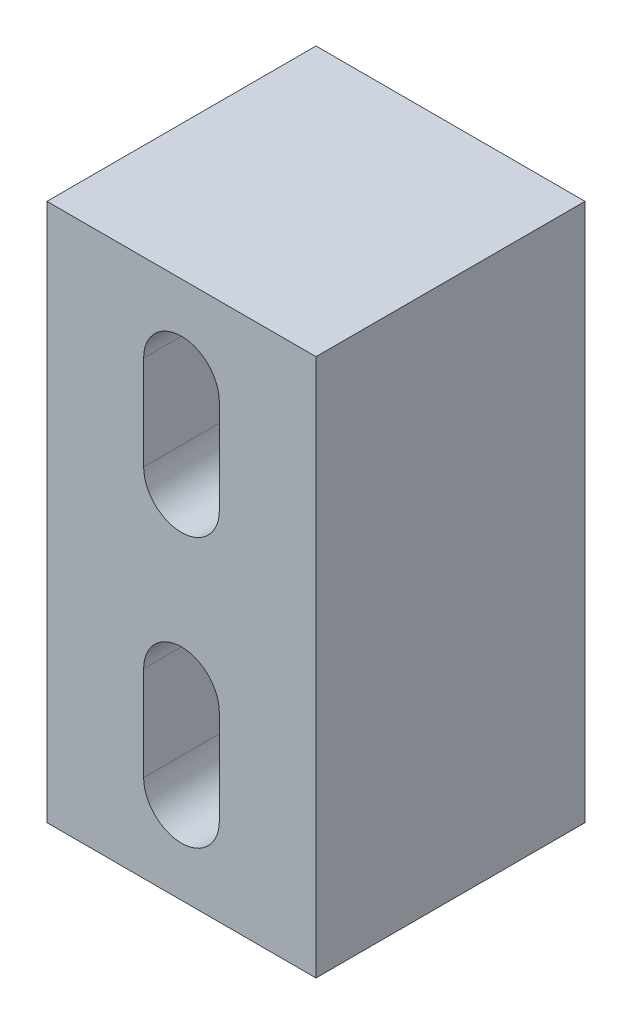
ISO-10303-21;
HEADER;
FILE_DESCRIPTION(('STEP AP214'),'2;1');
FILE_NAME('part.step','',(''),(''),'','','');
FILE_SCHEMA(('AUTOMOTIVE_DESIGN { 1 0 10303 214 1 1 1 1 }'));
ENDSEC;
DATA;
#1=APPLICATION_CONTEXT('core data for automotive mechanical design processes');
#2=APPLICATION_PROTOCOL_DEFINITION('international standard','automotive_design',2000,#1);
#3=PRODUCT_CONTEXT('',#1,'mechanical');
#4=PRODUCT('Part','Part','',(#3));
#5=PRODUCT_RELATED_PRODUCT_CATEGORY('part','',(#4));
#6=PRODUCT_DEFINITION_FORMATION('','',#4);
#7=PRODUCT_DEFINITION_CONTEXT('part definition',#1,'design');
#8=PRODUCT_DEFINITION('design','',#6,#7);
#9=PRODUCT_DEFINITION_SHAPE('','',#8);
#10=(LENGTH_UNIT() NAMED_UNIT(*) SI_UNIT(.MILLI.,.METRE.));
#11=(NAMED_UNIT(*) PLANE_ANGLE_UNIT() SI_UNIT($,.RADIAN.));
#12=(NAMED_UNIT(*) SI_UNIT($,.STERADIAN.) SOLID_ANGLE_UNIT());
#13=UNCERTAINTY_MEASURE_WITH_UNIT(LENGTH_MEASURE(1.E-05),#10,'distance_accuracy_value','');
#14=(GEOMETRIC_REPRESENTATION_CONTEXT(3) GLOBAL_UNCERTAINTY_ASSIGNED_CONTEXT((#13)) GLOBAL_UNIT_ASSIGNED_CONTEXT((#10,
#11,#12)) REPRESENTATION_CONTEXT('',''));
#15=CARTESIAN_POINT('',(0.,0.,0.));
#16=DIRECTION('',(0.,0.,1.));
#17=DIRECTION('',(1.,0.,0.));
#18=AXIS2_PLACEMENT_3D('',#15,#16,#17);
#19=CARTESIAN_POINT('',(12.7,25.4,25.4));
#20=DIRECTION('',(-1.,0.,0.));
#21=DIRECTION('',(0.,-1.,0.));
#22=AXIS2_PLACEMENT_3D('',#19,#20,#21);
#23=PLANE('',#22);
#24=DIRECTION('',(0.,1.,0.));
#25=VECTOR('',#24,1.);
#26=CARTESIAN_POINT('',(12.7,25.4,0.));
#27=LINE('',#26,#25);
#28=CARTESIAN_POINT('',(12.7,-25.4,0.));
#29=VERTEX_POINT('',#28);
#30=CARTESIAN_POINT('',(12.7,25.4,0.));
#31=VERTEX_POINT('',#30);
#32=EDGE_CURVE('E426',#29,#31,#27,.T.);
#33=ORIENTED_EDGE('',*,*,#32,.T.);
#34=DIRECTION('',(0.,0.,-1.));
#35=VECTOR('',#34,1.);
#36=CARTESIAN_POINT('',(12.7,25.4,25.4));
#37=LINE('',#36,#35);
#38=CARTESIAN_POINT('',(12.7,25.4,25.4));
#39=VERTEX_POINT('',#38);
#40=EDGE_CURVE('E453',#39,#31,#37,.T.);
#41=ORIENTED_EDGE('',*,*,#40,.F.);
#42=DIRECTION('',(0.,1.,0.));
#43=VECTOR('',#42,1.);
#44=CARTESIAN_POINT('',(12.7,25.4,25.4));
#45=LINE('',#44,#43);
#46=CARTESIAN_POINT('',(12.7,-25.4,25.4));
#47=VERTEX_POINT('',#46);
#48=EDGE_CURVE('E427',#47,#39,#45,.T.);
#49=ORIENTED_EDGE('',*,*,#48,.F.);
#50=DIRECTION('',(0.,0.,-1.));
#51=VECTOR('',#50,1.);
#52=CARTESIAN_POINT('',(12.7,-25.4,25.4));
#53=LINE('',#52,#51);
#54=EDGE_CURVE('E437',#47,#29,#53,.T.);
#55=ORIENTED_EDGE('',*,*,#54,.T.);
#56=EDGE_LOOP('',(#33,#41,#49,#55));
#57=FACE_BOUND('',#56,.T.);
#58=ADVANCED_FACE('F189',(#57),#23,.F.);
#59=CARTESIAN_POINT('',(-12.7,25.4,25.4));
#60=DIRECTION('',(0.,-1.,0.));
#61=DIRECTION('',(0.,0.,-1.));
#62=AXIS2_PLACEMENT_3D('',#59,#60,#61);
#63=PLANE('',#62);
#64=DIRECTION('',(-1.,0.,0.));
#65=VECTOR('',#64,1.);
#66=CARTESIAN_POINT('',(-12.7,25.4,0.));
#67=LINE('',#66,#65);
#68=CARTESIAN_POINT('',(-12.7,25.4,0.));
#69=VERTEX_POINT('',#68);
#70=EDGE_CURVE('E440',#31,#69,#67,.T.);
#71=ORIENTED_EDGE('',*,*,#70,.T.);
#72=DIRECTION('',(0.,0.,-1.));
#73=VECTOR('',#72,1.);
#74=CARTESIAN_POINT('',(-12.7,25.4,25.4));
#75=LINE('',#74,#73);
#76=CARTESIAN_POINT('',(-12.7,25.4,25.4));
#77=VERTEX_POINT('',#76);
#78=EDGE_CURVE('E450',#77,#69,#75,.T.);
#79=ORIENTED_EDGE('',*,*,#78,.F.);
#80=DIRECTION('',(-1.,0.,0.));
#81=VECTOR('',#80,1.);
#82=CARTESIAN_POINT('',(-12.7,25.4,25.4));
#83=LINE('',#82,#81);
#84=EDGE_CURVE('E430',#39,#77,#83,.T.);
#85=ORIENTED_EDGE('',*,*,#84,.F.);
#86=ORIENTED_EDGE('',*,*,#40,.T.);
#87=EDGE_LOOP('',(#71,#79,#85,#86));
#88=FACE_BOUND('',#87,.T.);
#89=ADVANCED_FACE('F511',(#88),#63,.F.);
#90=CARTESIAN_POINT('',(-12.7,25.4,25.4));
#91=DIRECTION('',(1.,0.,0.));
#92=DIRECTION('',(0.,1.,0.));
#93=AXIS2_PLACEMENT_3D('',#90,#91,#92);
#94=PLANE('',#93);
#95=DIRECTION('',(0.,-1.,0.));
#96=VECTOR('',#95,1.);
#97=CARTESIAN_POINT('',(-12.7,25.4,0.));
#98=LINE('',#97,#96);
#99=CARTESIAN_POINT('',(-12.7,-25.4,0.));
#100=VERTEX_POINT('',#99);
#101=EDGE_CURVE('E442',#69,#100,#98,.T.);
#102=ORIENTED_EDGE('',*,*,#101,.T.);
#103=DIRECTION('',(0.,0.,-1.));
#104=VECTOR('',#103,1.);
#105=CARTESIAN_POINT('',(-12.7,-25.4,25.4));
#106=LINE('',#105,#104);
#107=CARTESIAN_POINT('',(-12.7,-25.4,25.4));
#108=VERTEX_POINT('',#107);
#109=EDGE_CURVE('E447',#108,#100,#106,.T.);
#110=ORIENTED_EDGE('',*,*,#109,.F.);
#111=DIRECTION('',(0.,-1.,0.));
#112=VECTOR('',#111,1.);
#113=CARTESIAN_POINT('',(-12.7,25.4,25.4));
#114=LINE('',#113,#112);
#115=EDGE_CURVE('E433',#77,#108,#114,.T.);
#116=ORIENTED_EDGE('',*,*,#115,.F.);
#117=ORIENTED_EDGE('',*,*,#78,.T.);
#118=EDGE_LOOP('',(#102,#110,#116,#117));
#119=FACE_BOUND('',#118,.T.);
#120=ADVANCED_FACE('F516',(#119),#94,.F.);
#121=CARTESIAN_POINT('',(-12.7,-25.4,25.4));
#122=DIRECTION('',(0.,1.,0.));
#123=DIRECTION('',(0.,0.,1.));
#124=AXIS2_PLACEMENT_3D('',#121,#122,#123);
#125=PLANE('',#124);
#126=DIRECTION('',(1.,0.,0.));
#127=VECTOR('',#126,1.);
#128=CARTESIAN_POINT('',(-12.7,-25.4,0.));
#129=LINE('',#128,#127);
#130=EDGE_CURVE('E431',#100,#29,#129,.T.);
#131=ORIENTED_EDGE('',*,*,#130,.T.);
#132=ORIENTED_EDGE('',*,*,#54,.F.);
#133=DIRECTION('',(1.,0.,0.));
#134=VECTOR('',#133,1.);
#135=CARTESIAN_POINT('',(-12.7,-25.4,25.4));
#136=LINE('',#135,#134);
#137=EDGE_CURVE('E435',#108,#47,#136,.T.);
#138=ORIENTED_EDGE('',*,*,#137,.F.);
#139=ORIENTED_EDGE('',*,*,#109,.T.);
#140=EDGE_LOOP('',(#131,#132,#138,#139));
#141=FACE_BOUND('',#140,.T.);
#142=ADVANCED_FACE('F531',(#141),#125,.F.);
#143=CARTESIAN_POINT('',(0.,0.,25.4));
#144=DIRECTION('',(0.,0.,1.));
#145=DIRECTION('',(1.,0.,0.));
#146=AXIS2_PLACEMENT_3D('',#143,#144,#145);
#147=PLANE('',#146);
#148=DIRECTION('',(0.,1.,0.));
#149=VECTOR('',#148,1.);
#150=CARTESIAN_POINT('',(3.57251000000003,8.24865,25.4));
#151=LINE('',#150,#149);
#152=CARTESIAN_POINT('',(3.57250999999999,8.24865,25.4));
#153=VERTEX_POINT('',#152);
#154=CARTESIAN_POINT('',(3.57251000000003,17.15135,25.4));
#155=VERTEX_POINT('',#154);
#156=EDGE_CURVE('E345',#153,#155,#151,.T.);
#157=ORIENTED_EDGE('',*,*,#156,.F.);
#158=CARTESIAN_POINT('',(0.,8.24865,25.4));
#159=DIRECTION('',(0.,0.,1.));
#160=DIRECTION('',(1.,0.,0.));
#161=AXIS2_PLACEMENT_3D('',#158,#159,#160);
#162=CIRCLE('',#161,3.57250999999999);
#163=CARTESIAN_POINT('',(-3.57251000000003,8.24865,25.4));
#164=VERTEX_POINT('',#163);
#165=EDGE_CURVE('E334',#164,#153,#162,.T.);
#166=ORIENTED_EDGE('',*,*,#165,.F.);
#167=DIRECTION('',(0.,1.,0.));
#168=VECTOR('',#167,1.);
#169=CARTESIAN_POINT('',(-3.57250999999999,8.24865,25.4));
#170=LINE('',#169,#168);
#171=CARTESIAN_POINT('',(-3.57250999999999,17.15135,25.4));
#172=VERTEX_POINT('',#171);
#173=EDGE_CURVE('E355',#164,#172,#170,.T.);
#174=ORIENTED_EDGE('',*,*,#173,.T.);
#175=CARTESIAN_POINT('',(0.,17.15135,25.4));
#176=DIRECTION('',(0.,0.,1.));
#177=DIRECTION('',(1.,0.,0.));
#178=AXIS2_PLACEMENT_3D('',#175,#176,#177);
#179=CIRCLE('',#178,3.57250999999999);
#180=EDGE_CURVE('E367',#155,#172,#179,.T.);
#181=ORIENTED_EDGE('',*,*,#180,.F.);
#182=EDGE_LOOP('',(#157,#166,#174,#181));
#183=FACE_BOUND('',#182,.T.);
#184=DIRECTION('',(0.,1.,0.));
#185=VECTOR('',#184,1.);
#186=CARTESIAN_POINT('',(3.57251000000003,-17.15135,25.4));
#187=LINE('',#186,#185);
#188=CARTESIAN_POINT('',(3.57251,-17.15135,25.4));
#189=VERTEX_POINT('',#188);
#190=CARTESIAN_POINT('',(3.57251000000003,-8.24865,25.4));
#191=VERTEX_POINT('',#190);
#192=EDGE_CURVE('E376',#189,#191,#187,.T.);
#193=ORIENTED_EDGE('',*,*,#192,.F.);
#194=CARTESIAN_POINT('',(0.,-17.15135,25.4));
#195=DIRECTION('',(0.,0.,1.));
#196=DIRECTION('',(1.,0.,0.));
#197=AXIS2_PLACEMENT_3D('',#194,#195,#196);
#198=CIRCLE('',#197,3.57250999999999);
#199=CARTESIAN_POINT('',(-3.57251000000003,-17.15135,25.4));
#200=VERTEX_POINT('',#199);
#201=EDGE_CURVE('E399',#200,#189,#198,.T.);
#202=ORIENTED_EDGE('',*,*,#201,.F.);
#203=DIRECTION('',(0.,1.,0.));
#204=VECTOR('',#203,1.);
#205=CARTESIAN_POINT('',(-3.57250999999999,-17.15135,25.4));
#206=LINE('',#205,#204);
#207=CARTESIAN_POINT('',(-3.57250999999999,-8.24865,25.4));
#208=VERTEX_POINT('',#207);
#209=EDGE_CURVE('E387',#200,#208,#206,.T.);
#210=ORIENTED_EDGE('',*,*,#209,.T.);
#211=CARTESIAN_POINT('',(0.,-8.24865,25.4));
#212=DIRECTION('',(0.,0.,1.));
#213=DIRECTION('',(1.,0.,0.));
#214=AXIS2_PLACEMENT_3D('',#211,#212,#213);
#215=CIRCLE('',#214,3.57250999999999);
#216=EDGE_CURVE('E415',#191,#208,#215,.T.);
#217=ORIENTED_EDGE('',*,*,#216,.F.);
#218=EDGE_LOOP('',(#193,#202,#210,#217));
#219=FACE_BOUND('',#218,.T.);
#220=ORIENTED_EDGE('',*,*,#48,.T.);
#221=ORIENTED_EDGE('',*,*,#84,.T.);
#222=ORIENTED_EDGE('',*,*,#115,.T.);
#223=ORIENTED_EDGE('',*,*,#137,.T.);
#224=EDGE_LOOP('',(#220,#221,#222,#223));
#225=FACE_BOUND('',#224,.T.);
#226=ADVANCED_FACE('F493',(#183,#219,#225),#147,.T.);
#227=CARTESIAN_POINT('',(0.,0.,0.));
#228=DIRECTION('',(0.,0.,1.));
#229=DIRECTION('',(1.,0.,0.));
#230=AXIS2_PLACEMENT_3D('',#227,#228,#229);
#231=PLANE('',#230);
#232=CARTESIAN_POINT('',(0.,17.15135,0.));
#233=DIRECTION('',(0.,0.,1.));
#234=DIRECTION('',(1.,0.,0.));
#235=AXIS2_PLACEMENT_3D('',#232,#233,#234);
#236=CIRCLE('',#235,1.89865);
#237=CARTESIAN_POINT('',(1.89864999999999,17.15135,0.));
#238=VERTEX_POINT('',#237);
#239=CARTESIAN_POINT('',(-1.89865,17.15135,0.));
#240=VERTEX_POINT('',#239);
#241=EDGE_CURVE('E196',#238,#240,#236,.T.);
#242=ORIENTED_EDGE('',*,*,#241,.T.);
#243=DIRECTION('',(0.,-1.,0.));
#244=VECTOR('',#243,1.);
#245=CARTESIAN_POINT('',(-1.89864999999999,0.,0.));
#246=LINE('',#245,#244);
#247=CARTESIAN_POINT('',(-1.89864999999999,8.24865,0.));
#248=VERTEX_POINT('',#247);
#249=EDGE_CURVE('E13',#240,#248,#246,.T.);
#250=ORIENTED_EDGE('',*,*,#249,.T.);
#251=CARTESIAN_POINT('',(0.,8.24865,0.));
#252=DIRECTION('',(0.,0.,1.));
#253=DIRECTION('',(1.,0.,0.));
#254=AXIS2_PLACEMENT_3D('',#251,#252,#253);
#255=CIRCLE('',#254,1.89865);
#256=CARTESIAN_POINT('',(1.89864999999999,8.24865,0.));
#257=VERTEX_POINT('',#256);
#258=EDGE_CURVE('E471',#248,#257,#255,.T.);
#259=ORIENTED_EDGE('',*,*,#258,.T.);
#260=DIRECTION('',(0.,1.,0.));
#261=VECTOR('',#260,1.);
#262=CARTESIAN_POINT('',(1.89865,0.,0.));
#263=LINE('',#262,#261);
#264=EDGE_CURVE('E468',#257,#238,#263,.T.);
#265=ORIENTED_EDGE('',*,*,#264,.T.);
#266=EDGE_LOOP('',(#242,#250,#259,#265));
#267=FACE_BOUND('',#266,.T.);
#268=CARTESIAN_POINT('',(0.,-8.24865,0.));
#269=DIRECTION('',(0.,0.,1.));
#270=DIRECTION('',(1.,0.,0.));
#271=AXIS2_PLACEMENT_3D('',#268,#269,#270);
#272=CIRCLE('',#271,1.89865);
#273=CARTESIAN_POINT('',(1.89865,-8.24865,0.));
#274=VERTEX_POINT('',#273);
#275=CARTESIAN_POINT('',(-1.89864999999999,-8.24865,0.));
#276=VERTEX_POINT('',#275);
#277=EDGE_CURVE('E462',#274,#276,#272,.T.);
#278=ORIENTED_EDGE('',*,*,#277,.T.);
#279=DIRECTION('',(0.,-1.,0.));
#280=VECTOR('',#279,1.);
#281=CARTESIAN_POINT('',(-1.89864999999999,0.,0.));
#282=LINE('',#281,#280);
#283=CARTESIAN_POINT('',(-1.89864999999999,-17.15135,0.));
#284=VERTEX_POINT('',#283);
#285=EDGE_CURVE('E465',#276,#284,#282,.T.);
#286=ORIENTED_EDGE('',*,*,#285,.T.);
#287=CARTESIAN_POINT('',(0.,-17.15135,0.));
#288=DIRECTION('',(0.,0.,1.));
#289=DIRECTION('',(1.,0.,0.));
#290=AXIS2_PLACEMENT_3D('',#287,#288,#289);
#291=CIRCLE('',#290,1.89865);
#292=CARTESIAN_POINT('',(1.89865,-17.15135,0.));
#293=VERTEX_POINT('',#292);
#294=EDGE_CURVE('E459',#284,#293,#291,.T.);
#295=ORIENTED_EDGE('',*,*,#294,.T.);
#296=DIRECTION('',(0.,1.,0.));
#297=VECTOR('',#296,1.);
#298=CARTESIAN_POINT('',(1.89864999999999,0.,0.));
#299=LINE('',#298,#297);
#300=EDGE_CURVE('E456',#293,#274,#299,.T.);
#301=ORIENTED_EDGE('',*,*,#300,.T.);
#302=EDGE_LOOP('',(#278,#286,#295,#301));
#303=FACE_BOUND('',#302,.T.);
#304=ORIENTED_EDGE('',*,*,#32,.F.);
#305=ORIENTED_EDGE('',*,*,#130,.F.);
#306=ORIENTED_EDGE('',*,*,#101,.F.);
#307=ORIENTED_EDGE('',*,*,#70,.F.);
#308=EDGE_LOOP('',(#304,#305,#306,#307));
#309=FACE_BOUND('',#308,.T.);
#310=ADVANCED_FACE('F475',(#267,#303,#309),#231,.F.);
#311=CARTESIAN_POINT('',(0.,-8.24865,25.4));
#312=DIRECTION('',(0.,0.,1.));
#313=DIRECTION('',(1.,0.,0.));
#314=AXIS2_PLACEMENT_3D('',#311,#312,#313);
#315=CYLINDRICAL_SURFACE('',#314,1.89865);
#316=DIRECTION('',(0.,0.,-1.));
#317=VECTOR('',#316,1.);
#318=CARTESIAN_POINT('',(1.89865,-8.24865,-0.001000000000001));
#319=LINE('',#318,#317);
#320=CARTESIAN_POINT('',(1.89865,-8.24865,16.89481));
#321=VERTEX_POINT('',#320);
#322=EDGE_CURVE('E412',#321,#274,#319,.T.);
#323=ORIENTED_EDGE('',*,*,#322,.F.);
#324=CARTESIAN_POINT('',(0.,-8.24865,16.89481));
#325=DIRECTION('',(0.,0.,1.));
#326=DIRECTION('',(1.,0.,0.));
#327=AXIS2_PLACEMENT_3D('',#324,#325,#326);
#328=CIRCLE('',#327,1.89865);
#329=CARTESIAN_POINT('',(-1.89865,-8.24865,16.89481));
#330=VERTEX_POINT('',#329);
#331=EDGE_CURVE('E421',#321,#330,#328,.T.);
#332=ORIENTED_EDGE('',*,*,#331,.T.);
#333=DIRECTION('',(0.,0.,1.));
#334=VECTOR('',#333,1.);
#335=CARTESIAN_POINT('',(-1.89864999999999,-8.24865,25.4));
#336=LINE('',#335,#334);
#337=EDGE_CURVE('E407',#276,#330,#336,.T.);
#338=ORIENTED_EDGE('',*,*,#337,.F.);
#339=ORIENTED_EDGE('',*,*,#277,.F.);
#340=EDGE_LOOP('',(#323,#332,#338,#339));
#341=FACE_BOUND('',#340,.T.);
#342=ADVANCED_FACE('F542',(#341),#315,.F.);
#343=CARTESIAN_POINT('',(1.89865,-8.24865,16.89481));
#344=DIRECTION('',(0.,0.,-1.));
#345=DIRECTION('',(-1.,0.,0.));
#346=AXIS2_PLACEMENT_3D('',#343,#344,#345);
#347=PLANE('',#346);
#348=DIRECTION('',(0.,1.,0.));
#349=VECTOR('',#348,1.);
#350=CARTESIAN_POINT('',(-3.57250999999999,-17.15135,16.89481));
#351=LINE('',#350,#349);
#352=CARTESIAN_POINT('',(-3.57251,-17.15135,16.89481));
#353=VERTEX_POINT('',#352);
#354=CARTESIAN_POINT('',(-3.57250999999999,-8.24865,16.89481));
#355=VERTEX_POINT('',#354);
#356=EDGE_CURVE('E385',#353,#355,#351,.T.);
#357=ORIENTED_EDGE('',*,*,#356,.F.);
#358=CARTESIAN_POINT('',(0.,-17.15135,16.89481));
#359=DIRECTION('',(0.,0.,1.));
#360=DIRECTION('',(1.,0.,0.));
#361=AXIS2_PLACEMENT_3D('',#358,#359,#360);
#362=CIRCLE('',#361,3.57251);
#363=CARTESIAN_POINT('',(3.57251,-17.15135,16.89481));
#364=VERTEX_POINT('',#363);
#365=EDGE_CURVE('E401',#353,#364,#362,.T.);
#366=ORIENTED_EDGE('',*,*,#365,.T.);
#367=DIRECTION('',(0.,1.,0.));
#368=VECTOR('',#367,1.);
#369=CARTESIAN_POINT('',(3.57251,-17.15135,16.89481));
#370=LINE('',#369,#368);
#371=CARTESIAN_POINT('',(3.57251,-8.24865,16.89481));
#372=VERTEX_POINT('',#371);
#373=EDGE_CURVE('E378',#364,#372,#370,.T.);
#374=ORIENTED_EDGE('',*,*,#373,.T.);
#375=CARTESIAN_POINT('',(0.,-8.24865,16.89481));
#376=DIRECTION('',(0.,0.,1.));
#377=DIRECTION('',(1.,0.,0.));
#378=AXIS2_PLACEMENT_3D('',#375,#376,#377);
#379=CIRCLE('',#378,3.57251);
#380=EDGE_CURVE('E418',#372,#355,#379,.T.);
#381=ORIENTED_EDGE('',*,*,#380,.T.);
#382=EDGE_LOOP('',(#357,#366,#374,#381));
#383=FACE_BOUND('',#382,.T.);
#384=ORIENTED_EDGE('',*,*,#331,.F.);
#385=DIRECTION('',(0.,1.,0.));
#386=VECTOR('',#385,1.);
#387=CARTESIAN_POINT('',(1.89865,-17.15135,16.89481));
#388=LINE('',#387,#386);
#389=CARTESIAN_POINT('',(1.89865,-17.15135,16.89481));
#390=VERTEX_POINT('',#389);
#391=EDGE_CURVE('E380',#390,#321,#388,.T.);
#392=ORIENTED_EDGE('',*,*,#391,.F.);
#393=CARTESIAN_POINT('',(0.,-17.15135,16.89481));
#394=DIRECTION('',(0.,0.,1.));
#395=DIRECTION('',(1.,0.,0.));
#396=AXIS2_PLACEMENT_3D('',#393,#394,#395);
#397=CIRCLE('',#396,1.89865);
#398=CARTESIAN_POINT('',(-1.89864999999999,-17.15135,16.89481));
#399=VERTEX_POINT('',#398);
#400=EDGE_CURVE('E403',#399,#390,#397,.T.);
#401=ORIENTED_EDGE('',*,*,#400,.F.);
#402=DIRECTION('',(0.,1.,0.));
#403=VECTOR('',#402,1.);
#404=CARTESIAN_POINT('',(-1.89864999999999,-17.15135,16.89481));
#405=LINE('',#404,#403);
#406=EDGE_CURVE('E382',#399,#330,#405,.T.);
#407=ORIENTED_EDGE('',*,*,#406,.T.);
#408=EDGE_LOOP('',(#384,#392,#401,#407));
#409=FACE_BOUND('',#408,.T.);
#410=ADVANCED_FACE('F547',(#383,#409),#347,.F.);
#411=CARTESIAN_POINT('',(0.,-8.24865,25.4));
#412=DIRECTION('',(0.,0.,1.));
#413=DIRECTION('',(1.,0.,0.));
#414=AXIS2_PLACEMENT_3D('',#411,#412,#413);
#415=CYLINDRICAL_SURFACE('',#414,3.57251);
#416=ORIENTED_EDGE('',*,*,#380,.F.);
#417=DIRECTION('',(0.,0.,-1.));
#418=VECTOR('',#417,1.);
#419=CARTESIAN_POINT('',(3.57251,-8.24865,16.89481));
#420=LINE('',#419,#418);
#421=EDGE_CURVE('E409',#191,#372,#420,.T.);
#422=ORIENTED_EDGE('',*,*,#421,.F.);
#423=ORIENTED_EDGE('',*,*,#216,.T.);
#424=DIRECTION('',(0.,0.,1.));
#425=VECTOR('',#424,1.);
#426=CARTESIAN_POINT('',(-3.57250999999999,-8.24865,25.4));
#427=LINE('',#426,#425);
#428=EDGE_CURVE('E424',#355,#208,#427,.T.);
#429=ORIENTED_EDGE('',*,*,#428,.F.);
#430=EDGE_LOOP('',(#416,#422,#423,#429));
#431=FACE_BOUND('',#430,.T.);
#432=ADVANCED_FACE('F551',(#431),#415,.F.);
#433=CARTESIAN_POINT('',(0.,-17.15135,25.4));
#434=DIRECTION('',(0.,0.,1.));
#435=DIRECTION('',(1.,0.,0.));
#436=AXIS2_PLACEMENT_3D('',#433,#434,#435);
#437=CYLINDRICAL_SURFACE('',#436,1.89865);
#438=DIRECTION('',(0.,0.,1.));
#439=VECTOR('',#438,1.);
#440=CARTESIAN_POINT('',(-1.89864999999999,-17.15135,25.4));
#441=LINE('',#440,#439);
#442=EDGE_CURVE('E390',#399,#284,#441,.F.);
#443=ORIENTED_EDGE('',*,*,#442,.F.);
#444=ORIENTED_EDGE('',*,*,#400,.T.);
#445=DIRECTION('',(0.,0.,-1.));
#446=VECTOR('',#445,1.);
#447=CARTESIAN_POINT('',(1.89865,-17.15135,-0.001000000000001));
#448=LINE('',#447,#446);
#449=EDGE_CURVE('E396',#390,#293,#448,.T.);
#450=ORIENTED_EDGE('',*,*,#449,.T.);
#451=ORIENTED_EDGE('',*,*,#294,.F.);
#452=EDGE_LOOP('',(#443,#444,#450,#451));
#453=FACE_BOUND('',#452,.T.);
#454=ADVANCED_FACE('F555',(#453),#437,.F.);
#455=CARTESIAN_POINT('',(0.,-17.15135,25.4));
#456=DIRECTION('',(0.,0.,1.));
#457=DIRECTION('',(1.,0.,0.));
#458=AXIS2_PLACEMENT_3D('',#455,#456,#457);
#459=CYLINDRICAL_SURFACE('',#458,3.57251);
#460=ORIENTED_EDGE('',*,*,#201,.T.);
#461=DIRECTION('',(0.,0.,-1.));
#462=VECTOR('',#461,1.);
#463=CARTESIAN_POINT('',(3.57251,-17.15135,16.89481));
#464=LINE('',#463,#462);
#465=EDGE_CURVE('E393',#189,#364,#464,.T.);
#466=ORIENTED_EDGE('',*,*,#465,.T.);
#467=ORIENTED_EDGE('',*,*,#365,.F.);
#468=DIRECTION('',(0.,0.,1.));
#469=VECTOR('',#468,1.);
#470=CARTESIAN_POINT('',(-3.57250999999999,-17.15135,25.4));
#471=LINE('',#470,#469);
#472=EDGE_CURVE('E405',#200,#353,#471,.F.);
#473=ORIENTED_EDGE('',*,*,#472,.F.);
#474=EDGE_LOOP('',(#460,#466,#467,#473));
#475=FACE_BOUND('',#474,.T.);
#476=ADVANCED_FACE('F559',(#475),#459,.F.);
#477=CARTESIAN_POINT('',(-3.57250999999999,-17.15135,25.4));
#478=DIRECTION('',(-1.,0.,0.));
#479=DIRECTION('',(0.,-1.,0.));
#480=AXIS2_PLACEMENT_3D('',#477,#478,#479);
#481=PLANE('',#480);
#482=ORIENTED_EDGE('',*,*,#428,.T.);
#483=ORIENTED_EDGE('',*,*,#209,.F.);
#484=ORIENTED_EDGE('',*,*,#472,.T.);
#485=ORIENTED_EDGE('',*,*,#356,.T.);
#486=EDGE_LOOP('',(#482,#483,#484,#485));
#487=FACE_BOUND('',#486,.T.);
#488=ADVANCED_FACE('F563',(#487),#481,.F.);
#489=CARTESIAN_POINT('',(-1.89864999999999,-17.15135,25.4));
#490=DIRECTION('',(-1.,0.,0.));
#491=DIRECTION('',(0.,-1.,0.));
#492=AXIS2_PLACEMENT_3D('',#489,#490,#491);
#493=PLANE('',#492);
#494=ORIENTED_EDGE('',*,*,#337,.T.);
#495=ORIENTED_EDGE('',*,*,#406,.F.);
#496=ORIENTED_EDGE('',*,*,#442,.T.);
#497=ORIENTED_EDGE('',*,*,#285,.F.);
#498=EDGE_LOOP('',(#494,#495,#496,#497));
#499=FACE_BOUND('',#498,.T.);
#500=ADVANCED_FACE('F567',(#499),#493,.F.);
#501=CARTESIAN_POINT('',(1.89865,-17.15135,-0.001000000000001));
#502=DIRECTION('',(1.,0.,0.));
#503=DIRECTION('',(0.,0.,-1.));
#504=AXIS2_PLACEMENT_3D('',#501,#502,#503);
#505=PLANE('',#504);
#506=ORIENTED_EDGE('',*,*,#449,.F.);
#507=ORIENTED_EDGE('',*,*,#391,.T.);
#508=ORIENTED_EDGE('',*,*,#322,.T.);
#509=ORIENTED_EDGE('',*,*,#300,.F.);
#510=EDGE_LOOP('',(#506,#507,#508,#509));
#511=FACE_BOUND('',#510,.T.);
#512=ADVANCED_FACE('F571',(#511),#505,.F.);
#513=CARTESIAN_POINT('',(3.57251,-17.15135,16.89481));
#514=DIRECTION('',(1.,0.,0.));
#515=DIRECTION('',(0.,0.,-1.));
#516=AXIS2_PLACEMENT_3D('',#513,#514,#515);
#517=PLANE('',#516);
#518=ORIENTED_EDGE('',*,*,#421,.T.);
#519=ORIENTED_EDGE('',*,*,#373,.F.);
#520=ORIENTED_EDGE('',*,*,#465,.F.);
#521=ORIENTED_EDGE('',*,*,#192,.T.);
#522=EDGE_LOOP('',(#518,#519,#520,#521));
#523=FACE_BOUND('',#522,.T.);
#524=ADVANCED_FACE('F575',(#523),#517,.F.);
#525=CARTESIAN_POINT('',(0.,17.15135,25.4));
#526=DIRECTION('',(0.,0.,1.));
#527=DIRECTION('',(1.,0.,0.));
#528=AXIS2_PLACEMENT_3D('',#525,#526,#527);
#529=CYLINDRICAL_SURFACE('',#528,1.89865);
#530=DIRECTION('',(0.,0.,-1.));
#531=VECTOR('',#530,1.);
#532=CARTESIAN_POINT('',(1.89864999999999,17.15135,-0.001000000000001));
#533=LINE('',#532,#531);
#534=CARTESIAN_POINT('',(1.89865,17.15135,16.89481));
#535=VERTEX_POINT('',#534);
#536=EDGE_CURVE('E364',#535,#238,#533,.T.);
#537=ORIENTED_EDGE('',*,*,#536,.F.);
#538=CARTESIAN_POINT('',(0.,17.15135,16.89481));
#539=DIRECTION('',(0.,0.,1.));
#540=DIRECTION('',(1.,0.,0.));
#541=AXIS2_PLACEMENT_3D('',#538,#539,#540);
#542=CIRCLE('',#541,1.89865);
#543=CARTESIAN_POINT('',(-1.89865,17.15135,16.89481));
#544=VERTEX_POINT('',#543);
#545=EDGE_CURVE('E372',#535,#544,#542,.T.);
#546=ORIENTED_EDGE('',*,*,#545,.T.);
#547=DIRECTION('',(0.,0.,1.));
#548=VECTOR('',#547,1.);
#549=CARTESIAN_POINT('',(-1.89865,17.15135,25.4));
#550=LINE('',#549,#548);
#551=EDGE_CURVE('E211',#240,#544,#550,.T.);
#552=ORIENTED_EDGE('',*,*,#551,.F.);
#553=ORIENTED_EDGE('',*,*,#241,.F.);
#554=EDGE_LOOP('',(#537,#546,#552,#553));
#555=FACE_BOUND('',#554,.T.);
#556=ADVANCED_FACE('F478',(#555),#529,.F.);
#557=CARTESIAN_POINT('',(1.89865,17.15135,16.89481));
#558=DIRECTION('',(0.,0.,-1.));
#559=DIRECTION('',(-1.,0.,0.));
#560=AXIS2_PLACEMENT_3D('',#557,#558,#559);
#561=PLANE('',#560);
#562=DIRECTION('',(0.,1.,0.));
#563=VECTOR('',#562,1.);
#564=CARTESIAN_POINT('',(-3.57251,8.24865,16.89481));
#565=LINE('',#564,#563);
#566=CARTESIAN_POINT('',(-3.57251,8.24865,16.89481));
#567=VERTEX_POINT('',#566);
#568=CARTESIAN_POINT('',(-3.57251,17.15135,16.89481));
#569=VERTEX_POINT('',#568);
#570=EDGE_CURVE('E331',#567,#569,#565,.T.);
#571=ORIENTED_EDGE('',*,*,#570,.F.);
#572=CARTESIAN_POINT('',(0.,8.24865,16.89481));
#573=DIRECTION('',(0.,0.,1.));
#574=DIRECTION('',(1.,0.,0.));
#575=AXIS2_PLACEMENT_3D('',#572,#573,#574);
#576=CIRCLE('',#575,3.57251);
#577=CARTESIAN_POINT('',(3.57251,8.24865,16.89481));
#578=VERTEX_POINT('',#577);
#579=EDGE_CURVE('E324',#567,#578,#576,.T.);
#580=ORIENTED_EDGE('',*,*,#579,.T.);
#581=DIRECTION('',(0.,1.,0.));
#582=VECTOR('',#581,1.);
#583=CARTESIAN_POINT('',(3.57251,8.24865,16.89481));
#584=LINE('',#583,#582);
#585=CARTESIAN_POINT('',(3.57251,17.15135,16.89481));
#586=VERTEX_POINT('',#585);
#587=EDGE_CURVE('E329',#578,#586,#584,.T.);
#588=ORIENTED_EDGE('',*,*,#587,.T.);
#589=CARTESIAN_POINT('',(0.,17.15135,16.89481));
#590=DIRECTION('',(0.,0.,1.));
#591=DIRECTION('',(1.,0.,0.));
#592=AXIS2_PLACEMENT_3D('',#589,#590,#591);
#593=CIRCLE('',#592,3.57251);
#594=EDGE_CURVE('E370',#586,#569,#593,.T.);
#595=ORIENTED_EDGE('',*,*,#594,.T.);
#596=EDGE_LOOP('',(#571,#580,#588,#595));
#597=FACE_BOUND('',#596,.T.);
#598=ORIENTED_EDGE('',*,*,#545,.F.);
#599=DIRECTION('',(0.,1.,0.));
#600=VECTOR('',#599,1.);
#601=CARTESIAN_POINT('',(1.89865,8.24865,16.89481));
#602=LINE('',#601,#600);
#603=CARTESIAN_POINT('',(1.89865,8.24865,16.89481));
#604=VERTEX_POINT('',#603);
#605=EDGE_CURVE('E344',#604,#535,#602,.T.);
#606=ORIENTED_EDGE('',*,*,#605,.F.);
#607=CARTESIAN_POINT('',(0.,8.24865,16.89481));
#608=DIRECTION('',(0.,0.,1.));
#609=DIRECTION('',(1.,0.,0.));
#610=AXIS2_PLACEMENT_3D('',#607,#608,#609);
#611=CIRCLE('',#610,1.89865);
#612=CARTESIAN_POINT('',(-1.89864999999999,8.24865,16.89481));
#613=VERTEX_POINT('',#612);
#614=EDGE_CURVE('E333',#613,#604,#611,.T.);
#615=ORIENTED_EDGE('',*,*,#614,.F.);
#616=DIRECTION('',(0.,1.,0.));
#617=VECTOR('',#616,1.);
#618=CARTESIAN_POINT('',(-1.89865,8.24865,16.89481));
#619=LINE('',#618,#617);
#620=EDGE_CURVE('E484',#613,#544,#619,.T.);
#621=ORIENTED_EDGE('',*,*,#620,.T.);
#622=EDGE_LOOP('',(#598,#606,#615,#621));
#623=FACE_BOUND('',#622,.T.);
#624=ADVANCED_FACE('F326',(#597,#623),#561,.F.);
#625=CARTESIAN_POINT('',(0.,17.15135,25.4));
#626=DIRECTION('',(0.,0.,1.));
#627=DIRECTION('',(1.,0.,0.));
#628=AXIS2_PLACEMENT_3D('',#625,#626,#627);
#629=CYLINDRICAL_SURFACE('',#628,3.57251);
#630=ORIENTED_EDGE('',*,*,#594,.F.);
#631=DIRECTION('',(0.,0.,-1.));
#632=VECTOR('',#631,1.);
#633=CARTESIAN_POINT('',(3.57251,17.15135,16.89481));
#634=LINE('',#633,#632);
#635=EDGE_CURVE('E343',#155,#586,#634,.T.);
#636=ORIENTED_EDGE('',*,*,#635,.F.);
#637=ORIENTED_EDGE('',*,*,#180,.T.);
#638=DIRECTION('',(0.,0.,1.));
#639=VECTOR('',#638,1.);
#640=CARTESIAN_POINT('',(-3.57251,17.15135,25.4));
#641=LINE('',#640,#639);
#642=EDGE_CURVE('E374',#569,#172,#641,.T.);
#643=ORIENTED_EDGE('',*,*,#642,.F.);
#644=EDGE_LOOP('',(#630,#636,#637,#643));
#645=FACE_BOUND('',#644,.T.);
#646=ADVANCED_FACE('F499',(#645),#629,.F.);
#647=CARTESIAN_POINT('',(0.,8.24865,25.4));
#648=DIRECTION('',(0.,0.,1.));
#649=DIRECTION('',(1.,0.,0.));
#650=AXIS2_PLACEMENT_3D('',#647,#648,#649);
#651=CYLINDRICAL_SURFACE('',#650,1.89865);
#652=DIRECTION('',(0.,0.,1.));
#653=VECTOR('',#652,1.);
#654=CARTESIAN_POINT('',(-1.89864999999999,8.24865,25.4));
#655=LINE('',#654,#653);
#656=EDGE_CURVE('E350',#613,#248,#655,.F.);
#657=ORIENTED_EDGE('',*,*,#656,.F.);
#658=ORIENTED_EDGE('',*,*,#614,.T.);
#659=DIRECTION('',(0.,0.,-1.));
#660=VECTOR('',#659,1.);
#661=CARTESIAN_POINT('',(1.89864999999999,8.24865,-0.001000000000001));
#662=LINE('',#661,#660);
#663=EDGE_CURVE('E349',#604,#257,#662,.T.);
#664=ORIENTED_EDGE('',*,*,#663,.T.);
#665=ORIENTED_EDGE('',*,*,#258,.F.);
#666=EDGE_LOOP('',(#657,#658,#664,#665));
#667=FACE_BOUND('',#666,.T.);
#668=ADVANCED_FACE('F501',(#667),#651,.F.);
#669=CARTESIAN_POINT('',(0.,8.24865,25.4));
#670=DIRECTION('',(0.,0.,1.));
#671=DIRECTION('',(1.,0.,0.));
#672=AXIS2_PLACEMENT_3D('',#669,#670,#671);
#673=CYLINDRICAL_SURFACE('',#672,3.57251);
#674=ORIENTED_EDGE('',*,*,#165,.T.);
#675=DIRECTION('',(0.,0.,-1.));
#676=VECTOR('',#675,1.);
#677=CARTESIAN_POINT('',(3.57251,8.24865,16.89481));
#678=LINE('',#677,#676);
#679=EDGE_CURVE('E340',#153,#578,#678,.T.);
#680=ORIENTED_EDGE('',*,*,#679,.T.);
#681=ORIENTED_EDGE('',*,*,#579,.F.);
#682=DIRECTION('',(0.,0.,1.));
#683=VECTOR('',#682,1.);
#684=CARTESIAN_POINT('',(-3.57251,8.24865,25.4));
#685=LINE('',#684,#683);
#686=EDGE_CURVE('E203',#164,#567,#685,.F.);
#687=ORIENTED_EDGE('',*,*,#686,.F.);
#688=EDGE_LOOP('',(#674,#680,#681,#687));
#689=FACE_BOUND('',#688,.T.);
#690=ADVANCED_FACE('F347',(#689),#673,.F.);
#691=CARTESIAN_POINT('',(-3.57251,8.24865,25.4));
#692=DIRECTION('',(-1.,0.,0.));
#693=DIRECTION('',(0.,-1.,0.));
#694=AXIS2_PLACEMENT_3D('',#691,#692,#693);
#695=PLANE('',#694);
#696=ORIENTED_EDGE('',*,*,#642,.T.);
#697=ORIENTED_EDGE('',*,*,#173,.F.);
#698=ORIENTED_EDGE('',*,*,#686,.T.);
#699=ORIENTED_EDGE('',*,*,#570,.T.);
#700=EDGE_LOOP('',(#696,#697,#698,#699));
#701=FACE_BOUND('',#700,.T.);
#702=ADVANCED_FACE('F496',(#701),#695,.F.);
#703=CARTESIAN_POINT('',(-1.89864999999999,8.24865,25.4));
#704=DIRECTION('',(-1.,0.,0.));
#705=DIRECTION('',(0.,-1.,0.));
#706=AXIS2_PLACEMENT_3D('',#703,#704,#705);
#707=PLANE('',#706);
#708=ORIENTED_EDGE('',*,*,#551,.T.);
#709=ORIENTED_EDGE('',*,*,#620,.F.);
#710=ORIENTED_EDGE('',*,*,#656,.T.);
#711=ORIENTED_EDGE('',*,*,#249,.F.);
#712=EDGE_LOOP('',(#708,#709,#710,#711));
#713=FACE_BOUND('',#712,.T.);
#714=ADVANCED_FACE('F616',(#713),#707,.F.);
#715=CARTESIAN_POINT('',(1.89864999999999,8.24865,-0.001000000000001));
#716=DIRECTION('',(1.,0.,0.));
#717=DIRECTION('',(0.,0.,-1.));
#718=AXIS2_PLACEMENT_3D('',#715,#716,#717);
#719=PLANE('',#718);
#720=ORIENTED_EDGE('',*,*,#663,.F.);
#721=ORIENTED_EDGE('',*,*,#605,.T.);
#722=ORIENTED_EDGE('',*,*,#536,.T.);
#723=ORIENTED_EDGE('',*,*,#264,.F.);
#724=EDGE_LOOP('',(#720,#721,#722,#723));
#725=FACE_BOUND('',#724,.T.);
#726=ADVANCED_FACE('F482',(#725),#719,.F.);
#727=CARTESIAN_POINT('',(3.57251,8.24865,16.89481));
#728=DIRECTION('',(1.,0.,0.));
#729=DIRECTION('',(0.,0.,-1.));
#730=AXIS2_PLACEMENT_3D('',#727,#728,#729);
#731=PLANE('',#730);
#732=ORIENTED_EDGE('',*,*,#635,.T.);
#733=ORIENTED_EDGE('',*,*,#587,.F.);
#734=ORIENTED_EDGE('',*,*,#679,.F.);
#735=ORIENTED_EDGE('',*,*,#156,.T.);
#736=EDGE_LOOP('',(#732,#733,#734,#735));
#737=FACE_BOUND('',#736,.T.);
#738=ADVANCED_FACE('F339',(#737),#731,.F.);
#739=CLOSED_SHELL('',(#58,#89,#120,#142,#226,#310,#342,#410,#432,#454,#476,#488,#500,#512,#524,
#556,#624,#646,#668,#690,#702,#714,#726,#738));
#740=MANIFOLD_SOLID_BREP('B2',#739);
#741=ADVANCED_BREP_SHAPE_REPRESENTATION('',(#18,#740),#14);
#742=SHAPE_DEFINITION_REPRESENTATION(#9,#741);
ENDSEC;
END-ISO-10303-21;
